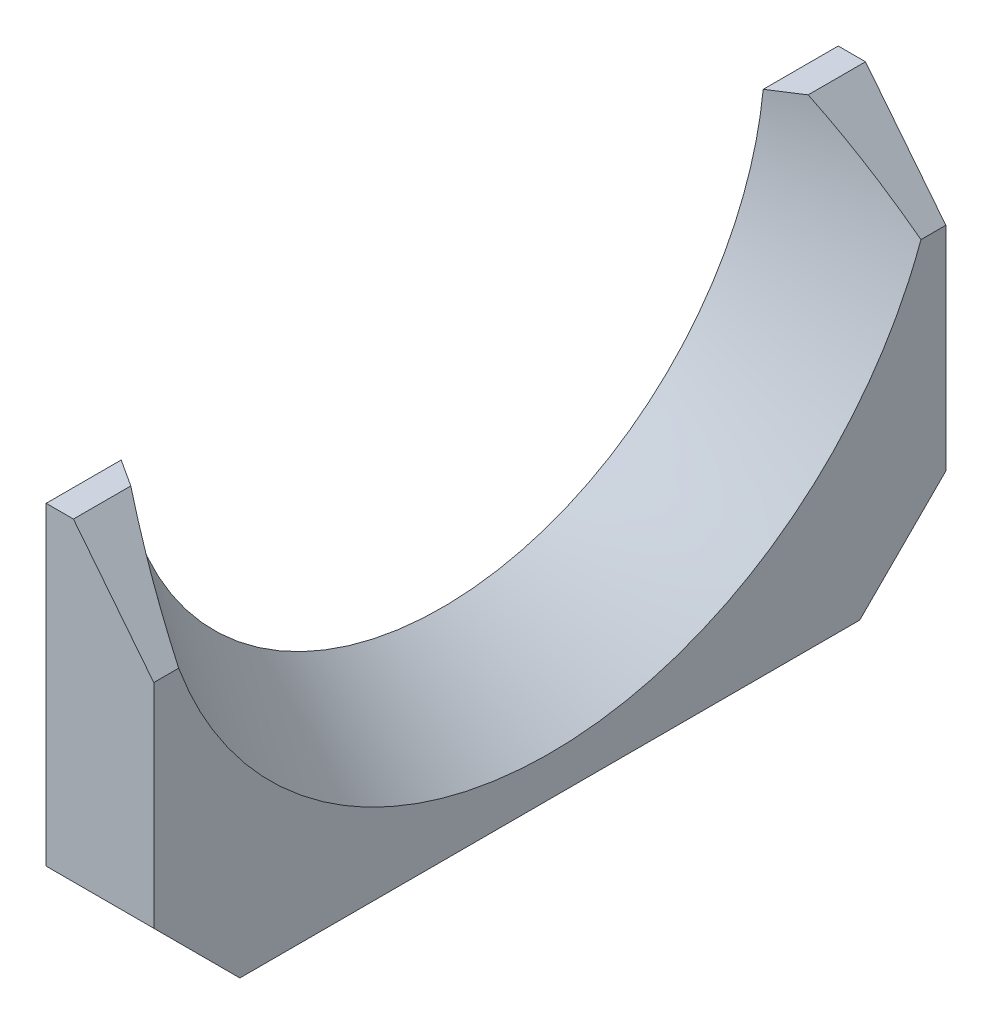
ISO-10303-21;
HEADER;
FILE_DESCRIPTION(('STEP AP214'),'2;1');
FILE_NAME('part.step','',(''),(''),'','','');
FILE_SCHEMA(('AUTOMOTIVE_DESIGN { 1 0 10303 214 1 1 1 1 }'));
ENDSEC;
DATA;
#1=APPLICATION_CONTEXT('core data for automotive mechanical design processes');
#2=APPLICATION_PROTOCOL_DEFINITION('international standard','automotive_design',2000,#1);
#3=PRODUCT_CONTEXT('',#1,'mechanical');
#4=PRODUCT('Part','Part','',(#3));
#5=PRODUCT_RELATED_PRODUCT_CATEGORY('part','',(#4));
#6=PRODUCT_DEFINITION_FORMATION('','',#4);
#7=PRODUCT_DEFINITION_CONTEXT('part definition',#1,'design');
#8=PRODUCT_DEFINITION('design','',#6,#7);
#9=PRODUCT_DEFINITION_SHAPE('','',#8);
#10=(LENGTH_UNIT() NAMED_UNIT(*) SI_UNIT(.MILLI.,.METRE.));
#11=(NAMED_UNIT(*) PLANE_ANGLE_UNIT() SI_UNIT($,.RADIAN.));
#12=(NAMED_UNIT(*) SI_UNIT($,.STERADIAN.) SOLID_ANGLE_UNIT());
#13=UNCERTAINTY_MEASURE_WITH_UNIT(LENGTH_MEASURE(1.E-05),#10,'distance_accuracy_value','');
#14=(GEOMETRIC_REPRESENTATION_CONTEXT(3) GLOBAL_UNCERTAINTY_ASSIGNED_CONTEXT((#13)) GLOBAL_UNIT_ASSIGNED_CONTEXT((#10,
#11,#12)) REPRESENTATION_CONTEXT('',''));
#15=CARTESIAN_POINT('',(0.,0.,0.));
#16=DIRECTION('',(0.,0.,1.));
#17=DIRECTION('',(1.,0.,0.));
#18=AXIS2_PLACEMENT_3D('',#15,#16,#17);
#19=CARTESIAN_POINT('',(40.,0.,46.));
#20=DIRECTION('',(-0.78388842022198,-0.620901718987707,0.));
#21=DIRECTION('',(0.620901718987707,-0.78388842022198,0.));
#22=AXIS2_PLACEMENT_3D('',#19,#20,#21);
#23=PLANE('',#22);
#24=CARTESIAN_POINT('',(25.0000000000023,18.9374999999923,45.0427405419363));
#25=CARTESIAN_POINT('',(24.4349773025542,19.6508411555235,45.0278701497398));
#26=CARTESIAN_POINT('',(23.8700509844943,20.3640606320755,45.0034108879433));
#27=CARTESIAN_POINT('',(22.7406011602301,21.78999103521,44.9352467037258));
#28=CARTESIAN_POINT('',(22.1760776897849,22.5027019166467,44.8915402449874));
#29=CARTESIAN_POINT('',(21.0477158224869,23.9272587741102,44.7848143878503));
#30=CARTESIAN_POINT('',(20.4838774481809,24.6391047216716,44.7217943702412));
#31=CARTESIAN_POINT('',(19.3568261069195,26.0620070400142,44.5762752048811));
#32=CARTESIAN_POINT('',(18.7936137290669,26.773062667053,44.4937642308345));
#33=CARTESIAN_POINT('',(17.6684393668148,28.1935952993963,44.3091200034553));
#34=CARTESIAN_POINT('',(17.1064773483213,28.9030723477443,44.2069872919556));
#35=CARTESIAN_POINT('',(15.9841193327255,30.3200493424341,43.9828904226733));
#36=CARTESIAN_POINT('',(15.423723282058,31.0275493564018,43.860926951877));
#37=CARTESIAN_POINT('',(13.6028358695461,33.326419714698,43.4312993554829));
#38=CARTESIAN_POINT('',(12.3459128192894,34.9132850656472,43.082599752207));
#39=CARTESIAN_POINT('',(10.4708018068084,37.2806127189044,42.480142461477));
#40=CARTESIAN_POINT('',(9.84757209589183,38.0674402289366,42.2661277226265));
#41=CARTESIAN_POINT('',(8.60495299673817,39.6362468416181,41.8109573894639));
#42=CARTESIAN_POINT('',(7.98556340546422,40.4182262006014,41.5698032432184));
#43=CARTESIAN_POINT('',(6.74351006973531,41.9863185369592,41.0564283648838));
#44=CARTESIAN_POINT('',(6.12090218631999,42.772360989771,40.7838569637255));
#45=CARTESIAN_POINT('',(4.88094976064341,44.3378009271877,40.2093177072164));
#46=CARTESIAN_POINT('',(4.2636050655579,45.1171986047332,39.9073507085924));
#47=CARTESIAN_POINT('',(3.03445801703282,46.6689967534961,39.2728910469721));
#48=CARTESIAN_POINT('',(2.42266027484338,47.4413914030103,38.940375161884));
#49=CARTESIAN_POINT('',(1.20593404427936,48.9775082690973,38.2439185855221));
#50=CARTESIAN_POINT('',(0.601006269719902,49.7412295844786,37.8799746619559));
#51=CARTESIAN_POINT('',(0.,50.5,37.4998029056484));
#52=B_SPLINE_CURVE_WITH_KNOTS('',3,(#24,#25,#26,#27,#28,#29,#30,#31,#32,#33,#34,#35,#36,#37,#38,
#39,#40,#41,#42,#43,#44,#45,#46,#47,#48,#49,#50,#51),.UNSPECIFIED.,.F.,.F.,(4,2,2,2,2,2,2,2,2,2,
2,2,2,4),(0.,2.730326248528,5.46087047207167,8.19150224852078,10.923795133035,13.6560125791106,
16.3881353946041,22.5473317867536,25.6259834380426,28.7044709007469,31.8214415569826,
34.9383213971172,38.0575904896956,41.1771807739762),.UNSPECIFIED.);
#53=CARTESIAN_POINT('',(12.5,34.71875,43.1091282926153));
#54=VERTEX_POINT('',#53);
#55=CARTESIAN_POINT('',(3.16831683168317,46.5,39.3385500107051));
#56=VERTEX_POINT('',#55);
#57=EDGE_CURVE('E260',#54,#56,#52,.T.);
#58=ORIENTED_EDGE('',*,*,#57,.T.);
#59=DIRECTION('',(0.,0.,1.));
#60=VECTOR('',#59,1.);
#61=CARTESIAN_POINT('',(3.16831683168317,46.5,-46.000025));
#62=LINE('',#61,#60);
#63=CARTESIAN_POINT('',(3.16831683168317,46.5,46.));
#64=VERTEX_POINT('',#63);
#65=EDGE_CURVE('E170',#56,#64,#62,.T.);
#66=ORIENTED_EDGE('',*,*,#65,.T.);
#67=DIRECTION('',(-0.620901718987707,0.78388842022198,0.));
#68=VECTOR('',#67,1.);
#69=CARTESIAN_POINT('',(40.,0.,46.));
#70=LINE('',#69,#68);
#71=CARTESIAN_POINT('',(12.5,34.71875,46.));
#72=VERTEX_POINT('',#71);
#73=EDGE_CURVE('E251',#72,#64,#70,.T.);
#74=ORIENTED_EDGE('',*,*,#73,.F.);
#75=DIRECTION('',(0.,0.,1.));
#76=VECTOR('',#75,1.);
#77=CARTESIAN_POINT('',(12.5,34.71875,-46.3822530127051));
#78=LINE('',#77,#76);
#79=EDGE_CURVE('E348',#54,#72,#78,.T.);
#80=ORIENTED_EDGE('',*,*,#79,.F.);
#81=EDGE_LOOP('',(#58,#66,#74,#80));
#82=FACE_BOUND('',#81,.T.);
#83=ADVANCED_FACE('F144',(#82),#23,.F.);
#84=CARTESIAN_POINT('',(0.,0.,46.));
#85=DIRECTION('',(0.,1.,0.));
#86=DIRECTION('',(0.,0.,1.));
#87=AXIS2_PLACEMENT_3D('',#84,#85,#86);
#88=PLANE('',#87);
#89=DIRECTION('',(0.,0.,-1.));
#90=VECTOR('',#89,1.);
#91=CARTESIAN_POINT('',(0.,0.,46.));
#92=LINE('',#91,#90);
#93=CARTESIAN_POINT('',(0.,0.,36.));
#94=VERTEX_POINT('',#93);
#95=CARTESIAN_POINT('',(0.,0.,-36.));
#96=VERTEX_POINT('',#95);
#97=EDGE_CURVE('E257',#94,#96,#92,.T.);
#98=ORIENTED_EDGE('',*,*,#97,.T.);
#99=DIRECTION('',(1.,0.,0.));
#100=VECTOR('',#99,1.);
#101=CARTESIAN_POINT('',(0.,0.,-36.));
#102=LINE('',#101,#100);
#103=CARTESIAN_POINT('',(12.5,0.,-36.));
#104=VERTEX_POINT('',#103);
#105=EDGE_CURVE('E444',#96,#104,#102,.T.);
#106=ORIENTED_EDGE('',*,*,#105,.T.);
#107=DIRECTION('',(0.,0.,1.));
#108=VECTOR('',#107,1.);
#109=CARTESIAN_POINT('',(12.5,0.,-46.3822530127051));
#110=LINE('',#109,#108);
#111=CARTESIAN_POINT('',(12.5,0.,36.));
#112=VERTEX_POINT('',#111);
#113=EDGE_CURVE('E349',#104,#112,#110,.T.);
#114=ORIENTED_EDGE('',*,*,#113,.T.);
#115=DIRECTION('',(-1.,0.,0.));
#116=VECTOR('',#115,1.);
#117=CARTESIAN_POINT('',(0.,0.,36.));
#118=LINE('',#117,#116);
#119=EDGE_CURVE('E443',#112,#94,#118,.T.);
#120=ORIENTED_EDGE('',*,*,#119,.T.);
#121=EDGE_LOOP('',(#98,#106,#114,#120));
#122=FACE_BOUND('',#121,.T.);
#123=ADVANCED_FACE('F387',(#122),#88,.F.);
#124=CARTESIAN_POINT('',(0.,50.5,46.));
#125=DIRECTION('',(1.,0.,0.));
#126=DIRECTION('',(0.,1.,0.));
#127=AXIS2_PLACEMENT_3D('',#124,#125,#126);
#128=PLANE('',#127);
#129=DIRECTION('',(0.,-1.,0.));
#130=VECTOR('',#129,1.);
#131=CARTESIAN_POINT('',(0.,50.5,46.));
#132=LINE('',#131,#130);
#133=CARTESIAN_POINT('',(0.,46.5,46.0000025));
#134=VERTEX_POINT('',#133);
#135=CARTESIAN_POINT('',(0.,10.,46.));
#136=VERTEX_POINT('',#135);
#137=EDGE_CURVE('E249',#134,#136,#132,.T.);
#138=ORIENTED_EDGE('',*,*,#137,.F.);
#139=DIRECTION('',(0.,0.,1.));
#140=VECTOR('',#139,1.);
#141=CARTESIAN_POINT('',(0.,46.5,-46.000025));
#142=LINE('',#141,#140);
#143=CARTESIAN_POINT('',(0.,46.5,37.2864864278492));
#144=VERTEX_POINT('',#143);
#145=EDGE_CURVE('E370',#144,#134,#142,.T.);
#146=ORIENTED_EDGE('',*,*,#145,.F.);
#147=CARTESIAN_POINT('',(0.,50.5,0.));
#148=DIRECTION('',(-1.,0.,0.));
#149=DIRECTION('',(0.,0.,1.));
#150=AXIS2_PLACEMENT_3D('',#147,#148,#149);
#151=CIRCLE('',#150,37.5);
#152=CARTESIAN_POINT('',(0.,13.5646498104053,-6.48304761451048));
#153=VERTEX_POINT('',#152);
#154=EDGE_CURVE('E148',#153,#144,#151,.T.);
#155=ORIENTED_EDGE('',*,*,#154,.F.);
#156=CARTESIAN_POINT('',(0.,34.8537732376838,-34.0799880883515));
#157=VERTEX_POINT('',#156);
#158=EDGE_CURVE('E253',#157,#153,#151,.T.);
#159=ORIENTED_EDGE('',*,*,#158,.F.);
#160=CARTESIAN_POINT('',(0.,46.4999999817167,-37.2864852261371));
#161=VERTEX_POINT('',#160);
#162=EDGE_CURVE('E354',#161,#157,#151,.T.);
#163=ORIENTED_EDGE('',*,*,#162,.F.);
#164=CARTESIAN_POINT('',(0.,46.5,-46.));
#165=VERTEX_POINT('',#164);
#166=EDGE_CURVE('E162',#165,#161,#142,.T.);
#167=ORIENTED_EDGE('',*,*,#166,.F.);
#168=DIRECTION('',(0.,-1.,0.));
#169=VECTOR('',#168,1.);
#170=CARTESIAN_POINT('',(0.,50.5,-46.));
#171=LINE('',#170,#169);
#172=CARTESIAN_POINT('',(0.,10.,-46.));
#173=VERTEX_POINT('',#172);
#174=EDGE_CURVE('E242',#165,#173,#171,.T.);
#175=ORIENTED_EDGE('',*,*,#174,.T.);
#176=DIRECTION('',(0.,0.707106781186549,-0.707106781186547));
#177=VECTOR('',#176,1.);
#178=CARTESIAN_POINT('',(0.,0.,-36.));
#179=LINE('',#178,#177);
#180=EDGE_CURVE('E426',#173,#96,#179,.F.);
#181=ORIENTED_EDGE('',*,*,#180,.T.);
#182=ORIENTED_EDGE('',*,*,#97,.F.);
#183=DIRECTION('',(0.,0.707106781186547,0.707106781186549));
#184=VECTOR('',#183,1.);
#185=CARTESIAN_POINT('',(0.,10.,46.));
#186=LINE('',#185,#184);
#187=EDGE_CURVE('E423',#94,#136,#186,.T.);
#188=ORIENTED_EDGE('',*,*,#187,.T.);
#189=EDGE_LOOP('',(#138,#146,#155,#159,#163,#167,#175,#181,#182,#188));
#190=FACE_BOUND('',#189,.T.);
#191=ADVANCED_FACE('F369',(#190),#128,.F.);
#192=DIRECTION('',(-0.620901718987707,0.78388842022198,0.));
#193=VECTOR('',#192,1.);
#194=CARTESIAN_POINT('',(40.,0.,-46.));
#195=LINE('',#194,#193);
#196=CARTESIAN_POINT('',(12.5,34.71875,-46.));
#197=VERTEX_POINT('',#196);
#198=CARTESIAN_POINT('',(3.16831683168317,46.5,-46.));
#199=VERTEX_POINT('',#198);
#200=EDGE_CURVE('E240',#197,#199,#195,.T.);
#201=ORIENTED_EDGE('',*,*,#200,.T.);
#202=CARTESIAN_POINT('',(3.16831683168317,46.5,-39.3388255070706));
#203=VERTEX_POINT('',#202);
#204=EDGE_CURVE('E227',#199,#203,#62,.T.);
#205=ORIENTED_EDGE('',*,*,#204,.T.);
#206=CARTESIAN_POINT('',(0.,50.5,-37.4998029056484));
#207=CARTESIAN_POINT('',(0.263737508595276,50.1670313953985,-37.6666061501655));
#208=CARTESIAN_POINT('',(0.528230736981965,49.8331086945603,-37.8303036478446));
#209=CARTESIAN_POINT('',(1.0586469731263,49.1634581964281,-38.1515685081798));
#210=CARTESIAN_POINT('',(1.32456997228431,48.8277304099911,-38.3091359076597));
#211=CARTESIAN_POINT('',(1.8577161523801,48.1546333576201,-38.6181943056714));
#212=CARTESIAN_POINT('',(2.12493907429329,47.8172644187048,-38.7696864632904));
#213=CARTESIAN_POINT('',(2.66066278466555,47.1409132343598,-39.0666839717316));
#214=CARTESIAN_POINT('',(2.92916357454526,46.8019309871366,-39.2121893158964));
#215=CARTESIAN_POINT('',(3.73647364477731,45.7827020234687,-39.6397238206521));
#216=CARTESIAN_POINT('',(4.27712304870118,45.1001321510148,-39.9127902352587));
#217=CARTESIAN_POINT('',(5.3620166485156,43.7304539812491,-40.4356824464389));
#218=CARTESIAN_POINT('',(5.9062557664341,43.043352094877,-40.6855356724375));
#219=CARTESIAN_POINT('',(6.99847308551007,41.6644277295435,-41.1631909029374));
#220=CARTESIAN_POINT('',(7.54645144302327,40.9726050531831,-41.3909919792075));
#221=CARTESIAN_POINT('',(8.64568194108116,39.5848265493851,-41.8250056638921));
#222=CARTESIAN_POINT('',(9.19693399960895,38.8888708254937,-42.0312188107636));
#223=CARTESIAN_POINT('',(10.0608885054493,37.7981282618702,-42.3368447490152));
#224=CARTESIAN_POINT('',(10.3726020566472,37.4045899034829,-42.4435601392261));
#225=CARTESIAN_POINT('',(10.9968894784973,36.6164270333972,-42.6502529860703));
#226=CARTESIAN_POINT('',(11.3094633514293,36.2218025188205,-42.7502304248301));
#227=CARTESIAN_POINT('',(12.2483331721397,35.0364793701736,-43.04025527509));
#228=CARTESIAN_POINT('',(12.8758176349026,34.2442802359355,-43.2204094449972));
#229=CARTESIAN_POINT('',(14.1335683881146,32.6563699100053,-43.555046360602));
#230=CARTESIAN_POINT('',(14.7638353394862,31.8606578838987,-43.7095226282767));
#231=CARTESIAN_POINT('',(16.0265767124356,30.2664469005501,-43.9931334896698));
#232=CARTESIAN_POINT('',(16.6590511519943,29.4679479206072,-44.1222678764757));
#233=CARTESIAN_POINT('',(17.6123540796288,28.2644029744686,-44.2976218659677));
#234=CARTESIAN_POINT('',(17.9325257370468,27.8601862569784,-44.3532503429463));
#235=CARTESIAN_POINT('',(18.5732756869726,27.0512394451971,-44.4580614041972));
#236=CARTESIAN_POINT('',(18.893853979606,26.6465093507475,-44.5072439864787));
#237=CARTESIAN_POINT('',(19.8561157445582,25.4316538724953,-44.6452497126539));
#238=CARTESIAN_POINT('',(20.4983358858484,24.6208509441163,-44.7245326307218));
#239=CARTESIAN_POINT('',(21.7834710553439,22.9983677926284,-44.8580437517072));
#240=CARTESIAN_POINT('',(22.4263856219267,22.1866881523179,-44.912283580887));
#241=CARTESIAN_POINT('',(23.7128244472575,20.5625591353371,-44.9959012512118));
#242=CARTESIAN_POINT('',(24.3563486927339,19.750109775422,-45.0252796216365));
#243=CARTESIAN_POINT('',(24.999999999999,18.9374999999972,-45.0422976354065));
#244=B_SPLINE_CURVE_WITH_KNOTS('',3,(#206,#207,#208,#209,#210,#211,#212,#213,#214,#215,#216,
#217,#218,#219,#220,#221,#222,#223,#224,#225,#226,#227,#228,#229,#230,#231,#232,#233,#234,#235,
#236,#237,#238,#239,#240,#241,#242,#243),.UNSPECIFIED.,.F.,.F.,(4,2,2,2,2,2,2,2,2,2,2,2,2,2,2,2,
2,2,4),(0.,1.36901308196145,2.73801793892773,4.10676035047547,5.47550428404584,8.21282572696977,
10.9468703952838,13.6810300965142,16.4151215846932,17.9548308734505,19.4945442463637,
22.5737716552522,25.653774716696,28.7338029248297,30.2897116257185,31.8456208071376,
34.9573916143532,38.0677163247409,41.1779748172413),.UNSPECIFIED.);
#245=CARTESIAN_POINT('',(12.5,34.71875,-43.1090931090802));
#246=VERTEX_POINT('',#245);
#247=EDGE_CURVE('E434',#203,#246,#244,.T.);
#248=ORIENTED_EDGE('',*,*,#247,.T.);
#249=EDGE_CURVE('E248',#197,#246,#78,.T.);
#250=ORIENTED_EDGE('',*,*,#249,.F.);
#251=EDGE_LOOP('',(#201,#205,#248,#250));
#252=FACE_BOUND('',#251,.T.);
#253=ADVANCED_FACE('F246',(#252),#23,.F.);
#254=CARTESIAN_POINT('',(0.,0.,46.));
#255=DIRECTION('',(0.,0.,1.));
#256=DIRECTION('',(1.,0.,0.));
#257=AXIS2_PLACEMENT_3D('',#254,#255,#256);
#258=PLANE('',#257);
#259=DIRECTION('',(1.,0.,0.));
#260=VECTOR('',#259,1.);
#261=CARTESIAN_POINT('',(0.,46.5,46.));
#262=LINE('',#261,#260);
#263=EDGE_CURVE('E243',#134,#64,#262,.T.);
#264=ORIENTED_EDGE('',*,*,#263,.F.);
#265=ORIENTED_EDGE('',*,*,#137,.T.);
#266=DIRECTION('',(1.,0.,0.));
#267=VECTOR('',#266,1.);
#268=CARTESIAN_POINT('',(12.5,10.,46.));
#269=LINE('',#268,#267);
#270=CARTESIAN_POINT('',(12.5,10.,46.));
#271=VERTEX_POINT('',#270);
#272=EDGE_CURVE('E429',#136,#271,#269,.T.);
#273=ORIENTED_EDGE('',*,*,#272,.T.);
#274=DIRECTION('',(0.,-1.,0.));
#275=VECTOR('',#274,1.);
#276=CARTESIAN_POINT('',(12.5,34.71875,46.));
#277=LINE('',#276,#275);
#278=EDGE_CURVE('E344',#72,#271,#277,.T.);
#279=ORIENTED_EDGE('',*,*,#278,.F.);
#280=ORIENTED_EDGE('',*,*,#73,.T.);
#281=EDGE_LOOP('',(#264,#265,#273,#279,#280));
#282=FACE_BOUND('',#281,.T.);
#283=ADVANCED_FACE('F290',(#282),#258,.T.);
#284=CARTESIAN_POINT('',(0.,0.,-46.));
#285=DIRECTION('',(0.,0.,1.));
#286=DIRECTION('',(1.,0.,0.));
#287=AXIS2_PLACEMENT_3D('',#284,#285,#286);
#288=PLANE('',#287);
#289=ORIENTED_EDGE('',*,*,#174,.F.);
#290=DIRECTION('',(1.,0.,0.));
#291=VECTOR('',#290,1.);
#292=CARTESIAN_POINT('',(0.,46.5,-46.));
#293=LINE('',#292,#291);
#294=EDGE_CURVE('E230',#165,#199,#293,.T.);
#295=ORIENTED_EDGE('',*,*,#294,.T.);
#296=ORIENTED_EDGE('',*,*,#200,.F.);
#297=DIRECTION('',(0.,-1.,0.));
#298=VECTOR('',#297,1.);
#299=CARTESIAN_POINT('',(12.5,0.,-46.));
#300=LINE('',#299,#298);
#301=CARTESIAN_POINT('',(12.5,10.,-46.));
#302=VERTEX_POINT('',#301);
#303=EDGE_CURVE('E352',#197,#302,#300,.T.);
#304=ORIENTED_EDGE('',*,*,#303,.T.);
#305=DIRECTION('',(-1.,0.,0.));
#306=VECTOR('',#305,1.);
#307=CARTESIAN_POINT('',(0.,10.,-46.));
#308=LINE('',#307,#306);
#309=EDGE_CURVE('E427',#302,#173,#308,.T.);
#310=ORIENTED_EDGE('',*,*,#309,.T.);
#311=EDGE_LOOP('',(#289,#295,#296,#304,#310));
#312=FACE_BOUND('',#311,.T.);
#313=ADVANCED_FACE('F238',(#312),#288,.F.);
#314=CARTESIAN_POINT('',(0.,34.8537732362068,-34.0799880876734));
#315=CARTESIAN_POINT('',(25.,40.534108750698,-54.0895647200741));
#316=CARTESIAN_POINT('',(0.,37.9421993699353,-35.4978939713758));
#317=CARTESIAN_POINT('',(25.,45.4358600310017,-54.9927023295476));
#318=CARTESIAN_POINT('',(0.,44.5064213949293,-37.4892226032101));
#319=CARTESIAN_POINT('',(25.,55.4858355052147,-55.4587889510262));
#320=CARTESIAN_POINT('',(0.,54.7937828809281,-37.7214219554838));
#321=CARTESIAN_POINT('',(25.,70.1952905972767,-52.0824620009772));
#322=CARTESIAN_POINT('',(0.,64.7654111776047,-35.183081038902));
#323=CARTESIAN_POINT('',(25.,83.4576574860455,-44.8809456377429));
#324=CARTESIAN_POINT('',(0.,73.6892417639536,-30.0600504656448));
#325=CARTESIAN_POINT('',(25.,94.2991024074197,-34.3822249993756));
#326=CARTESIAN_POINT('',(0.,80.9096675151136,-22.7289082244684));
#327=CARTESIAN_POINT('',(25.,101.923210445719,-21.3579000784437));
#328=CARTESIAN_POINT('',(0.,85.8960277861877,-13.7281995444291));
#329=CARTESIAN_POINT('',(25.0000000000001,105.769561623217,-6.76482651453678));
#330=CARTESIAN_POINT('',(0.,88.2827348449682,-3.71883631301551));
#331=CARTESIAN_POINT('',(25.,105.556511880247,8.32564274874456));
#332=CARTESIAN_POINT('',(0.,88.0228625331253,3.13586039033441));
#333=CARTESIAN_POINT('',(25.,102.717354982671,17.977504324728));
#334=CARTESIAN_POINT('',(0.,86.9131169948144,9.45832515013522));
#335=CARTESIAN_POINT('',(25.,98.8616710814252,26.5664763854993));
#336=CARTESIAN_POINT('',(0.,85.1464894166126,15.2819951924976));
#337=CARTESIAN_POINT('',(25.,94.251793353818,34.2096305743297));
#338=CARTESIAN_POINT('',(0.,80.4822698230476,23.129239398761));
#339=CARTESIAN_POINT('',(25.,84.793260692498,43.6857718481672));
#340=CARTESIAN_POINT('',(0.,74.0759901804474,29.6326052342755));
#341=CARTESIAN_POINT('',(25.,73.3421864472318,50.6236383917355));
#342=CARTESIAN_POINT('',(0.,68.8914944382186,32.8196273021602));
#343=CARTESIAN_POINT('',(25.,64.8230034984609,53.2867757338754));
#344=CARTESIAN_POINT('',(0.,63.0578006300647,35.4978939713758));
#345=CARTESIAN_POINT('',(25.,55.5641399689984,54.9927023295476));
#346=CARTESIAN_POINT('',(0.,56.4935786050708,37.48922260321));
#347=CARTESIAN_POINT('',(24.9999999999999,45.5141644947855,55.4587889510261));
#348=CARTESIAN_POINT('',(0.,46.2062171190719,37.7214219554838));
#349=CARTESIAN_POINT('',(25.0000000000001,30.8047094027232,52.0824620009773));
#350=CARTESIAN_POINT('',(0.,36.2345888223952,35.1830810389019));
#351=CARTESIAN_POINT('',(24.9999999999999,17.5423425139546,44.8809456377428));
#352=CARTESIAN_POINT('',(0.,27.3107582360466,30.0600504656449));
#353=CARTESIAN_POINT('',(25.0000000000001,6.70089759258029,34.3822249993757));
#354=CARTESIAN_POINT('',(0.,20.0903324848862,22.7289082244683));
#355=CARTESIAN_POINT('',(24.9999999999999,-0.923210445719292,21.3579000784437));
#356=CARTESIAN_POINT('',(0.,15.1039722138128,13.7281995444291));
#357=CARTESIAN_POINT('',(25.0000000000001,-4.76956162321752,6.76482651453685));
#358=CARTESIAN_POINT('',(0.,12.7172651550315,3.71883631301548));
#359=CARTESIAN_POINT('',(24.9999999999999,-4.55651188024707,-8.32564274874454));
#360=CARTESIAN_POINT('',(0.,12.9771374668747,-3.13586039033442));
#361=CARTESIAN_POINT('',(25.,-1.71735498267053,-17.977504324728));
#362=CARTESIAN_POINT('',(0.,14.0868830051856,-9.45832515013522));
#363=CARTESIAN_POINT('',(25.,2.13832891857479,-26.5664763854994));
#364=CARTESIAN_POINT('',(0.,15.8535105833874,-15.2819951924976));
#365=CARTESIAN_POINT('',(25.,6.74820664618212,-34.2096305743297));
#366=CARTESIAN_POINT('',(0.,20.5177301769525,-23.1292393987611));
#367=CARTESIAN_POINT('',(25.,16.2067393075018,-43.6857718481672));
#368=CARTESIAN_POINT('',(0.,26.9240098195525,-29.6326052342755));
#369=CARTESIAN_POINT('',(25.,27.6578135527684,-50.6236383917355));
#370=CARTESIAN_POINT('',(0.,32.1085055617814,-32.8196273021602));
#371=CARTESIAN_POINT('',(25.,36.1769965015392,-53.2867757338754));
#372=CARTESIAN_POINT('',(0.,34.8537732362068,-34.0799880876734));
#373=CARTESIAN_POINT('',(25.,40.534108750698,-54.0895647200741));
#374=B_SPLINE_SURFACE_WITH_KNOTS('',3,1,((#314,#315),(#316,#317),(#318,#319),(#320,#321),(#322,
#323),(#324,#325),(#326,#327),(#328,#329),(#330,#331),(#332,#333),(#334,#335),(#336,#337),(#338,
#339),(#340,#341),(#342,#343),(#344,#345),(#346,#347),(#348,#349),(#350,#351),(#352,#353),(#354,
#355),(#356,#357),(#358,#359),(#360,#361),(#362,#363),(#364,#365),(#366,#367),(#368,#369),(#370,
#371),(#372,#373)),.UNSPECIFIED.,.T.,.F.,.F.,(4,1,1,1,1,1,1,1,2,1,1,1,2,1,1,1,1,1,1,1,2,1,1,1,
4),(2,2),(0.,0.0432692307692308,0.0865384615384616,0.129807692307692,0.173076923076923,
0.216346153846154,0.259615384615385,0.302884615384615,0.346153846153846,0.384615384615385,
0.423076923076923,0.461538461538462,0.5,0.543269230769231,0.586538461538462,0.629807692307692,
0.673076923076923,0.716346153846154,0.759615384615385,0.802884615384616,0.846153846153846,
0.884615384615385,0.923076923076923,0.961538461538462,1.),(0.,1.),.UNSPECIFIED.);
#375=CARTESIAN_POINT('',(0.,46.499999999504,37.2863227244063));
#376=CARTESIAN_POINT('',(0.176946729238435,46.4999999998219,37.3988967846392));
#377=CARTESIAN_POINT('',(0.353730649428415,46.4999999999523,37.5117266475867));
#378=CARTESIAN_POINT('',(0.706978767695252,46.5000000000477,37.7378802287647));
#379=CARTESIAN_POINT('',(0.883442970307062,46.5000000000128,37.8512039399115));
#380=CARTESIAN_POINT('',(1.23606143296984,46.4999999999872,38.0783299300113));
#381=CARTESIAN_POINT('',(1.41221569507958,46.4999999999966,38.1921322057684));
#382=CARTESIAN_POINT('',(1.76422349326881,46.5000000000034,38.4202006646446));
#383=CARTESIAN_POINT('',(1.94007702952039,46.500000000001,38.5344668474981));
#384=CARTESIAN_POINT('',(2.29149270039638,46.499999999999,38.7634491680102));
#385=CARTESIAN_POINT('',(2.4670548329018,46.4999999999995,38.8781653089206));
#386=CARTESIAN_POINT('',(2.81789647882176,46.5000000000005,39.1080341527026));
#387=CARTESIAN_POINT('',(2.99317598836558,46.500000000001,39.2231868614821));
#388=CARTESIAN_POINT('',(3.16831683168317,46.5,39.3385500107051));
#389=B_SPLINE_CURVE_WITH_KNOTS('',3,(#375,#376,#377,#378,#379,#380,#381,#382,#383,#384,#385,
#386,#387,#388),.UNSPECIFIED.,.F.,.F.,(4,2,2,2,2,2,4),(0.,0.62916388720948,1.25831877922103,
1.88746947619089,2.51661981301992,3.14577470498072,3.77493814167807),.UNSPECIFIED.);
#390=EDGE_CURVE('E14',#144,#56,#389,.T.);
#391=CARTESIAN_POINT('',(12.5,34.71875,43.1091282926153));
#392=CARTESIAN_POINT('',(12.5,33.8463794662255,42.7896490217876));
#393=CARTESIAN_POINT('',(12.5,32.9836852288132,42.4437465480081));
#394=CARTESIAN_POINT('',(12.5,31.2807988006624,41.7004079366727));
#395=CARTESIAN_POINT('',(12.5,30.4406064744092,41.3029721095537));
#396=CARTESIAN_POINT('',(12.5,28.7858659068264,40.4578772720811));
#397=CARTESIAN_POINT('',(12.5,27.9713175672593,40.0102184541524));
#398=CARTESIAN_POINT('',(12.5,26.3722294451355,39.0667060535789));
#399=CARTESIAN_POINT('',(12.5,25.5876476915318,38.5709236011523));
#400=CARTESIAN_POINT('',(12.5,24.0499824267625,37.5327839818729));
#401=CARTESIAN_POINT('',(12.5,23.2968976158658,36.990428739686));
#402=CARTESIAN_POINT('',(12.5,21.8249136397961,35.8612866430162));
#403=CARTESIAN_POINT('',(12.5,21.1060116929777,35.2745034139882));
#404=CARTESIAN_POINT('',(12.5,19.7550531150557,34.1020121207245));
#405=CARTESIAN_POINT('',(12.5,19.1204621763175,33.5192265803735));
#406=CARTESIAN_POINT('',(12.5,18.19403838926,32.619000440864));
#407=CARTESIAN_POINT('',(12.5,17.8894671000185,32.3145760000573));
#408=CARTESIAN_POINT('',(12.5,17.2890612951009,31.6972300132996));
#409=CARTESIAN_POINT('',(12.5,16.9932267925368,31.3843084545974));
#410=CARTESIAN_POINT('',(12.5,16.1191656089087,30.433213056982));
#411=CARTESIAN_POINT('',(12.5,15.5543195331519,29.7826485121757));
#412=CARTESIAN_POINT('',(12.5,14.4622614841091,28.4510939506516));
#413=CARTESIAN_POINT('',(12.5,13.9350370188487,27.7701141563537));
#414=CARTESIAN_POINT('',(12.5,12.9195654389773,26.3796622864614));
#415=CARTESIAN_POINT('',(12.5,12.4313189290102,25.6701897691312));
#416=CARTESIAN_POINT('',(12.5,11.495407799131,24.2249576416553));
#417=CARTESIAN_POINT('',(12.5,11.0477425057734,23.4891984680193));
#418=CARTESIAN_POINT('',(12.5,10.3015253936201,22.1809564476458));
#419=CARTESIAN_POINT('',(12.5,9.99371091291937,21.6137396430488));
#420=CARTESIAN_POINT('',(12.5,9.40237852713675,20.4667864274978));
#421=CARTESIAN_POINT('',(12.5,9.11886217797601,19.8870492177763));
#422=CARTESIAN_POINT('',(12.5,8.3053436072265,18.1306637066507));
#423=CARTESIAN_POINT('',(12.5,7.81221503090123,16.9365663019572));
#424=CARTESIAN_POINT('',(12.5,7.14911963258702,15.1179430446931));
#425=CARTESIAN_POINT('',(12.5,6.94081955500184,14.5070288922546));
#426=CARTESIAN_POINT('',(12.5,6.55008508267962,13.2769191848157));
#427=CARTESIAN_POINT('',(12.5,6.36765071762962,12.6577236203113));
#428=CARTESIAN_POINT('',(12.5,6.02908336869998,11.4122014746953));
#429=CARTESIAN_POINT('',(12.5,5.87295019268726,10.7858749457119));
#430=CARTESIAN_POINT('',(12.5,5.58738588098783,9.52716482412734));
#431=CARTESIAN_POINT('',(12.5,5.45795470776366,8.89478124004248));
#432=CARTESIAN_POINT('',(12.5,5.22599684433854,7.62561864638101));
#433=CARTESIAN_POINT('',(12.5,5.12344830184203,6.98884364138036));
#434=CARTESIAN_POINT('',(12.5,4.94521635949211,5.71160469324331));
#435=CARTESIAN_POINT('',(12.5,4.8695330545389,5.07114073708399));
#436=CARTESIAN_POINT('',(12.5,4.68294588178157,3.14576867754041));
#437=CARTESIAN_POINT('',(12.5,4.61245340156577,1.85659900299184));
#438=CARTESIAN_POINT('',(12.5,4.58821569828158,-0.0776116829273122));
#439=CARTESIAN_POINT('',(12.5,4.59372399504493,-0.722480766962219));
#440=CARTESIAN_POINT('',(12.5,4.63202928325578,-2.01146563113061));
#441=CARTESIAN_POINT('',(12.5,4.66482620419221,-2.65558141320624));
#442=CARTESIAN_POINT('',(12.5,4.75764897923125,-3.94184314430899));
#443=CARTESIAN_POINT('',(12.5,4.81767488794818,-4.58398908938252));
#444=CARTESIAN_POINT('',(12.5,4.96469645124989,-5.86514781232681));
#445=CARTESIAN_POINT('',(12.5,5.0516922306996,-6.50416057567767));
#446=CARTESIAN_POINT('',(12.5,5.35300579667806,-8.41592311714317));
#447=CARTESIAN_POINT('',(12.5,5.60759000777103,-9.68257246411134));
#448=CARTESIAN_POINT('',(12.5,6.22231647864563,-12.1898351862031));
#449=CARTESIAN_POINT('',(12.5,6.58245815917005,-13.4304487041608));
#450=CARTESIAN_POINT('',(12.5,7.4063795523441,-15.8766808242099));
#451=CARTESIAN_POINT('',(12.5,7.87015260656652,-17.0823016689975));
#452=CARTESIAN_POINT('',(12.5,8.8974075903408,-19.4504471526757));
#453=CARTESIAN_POINT('',(12.5,9.46088973772798,-20.6129716974068));
#454=CARTESIAN_POINT('',(12.5,10.3779630560019,-22.3181982104524));
#455=CARTESIAN_POINT('',(12.5,10.6957748528688,-22.8804038657595));
#456=CARTESIAN_POINT('',(12.5,11.3548921833384,-23.9908737446562));
#457=CARTESIAN_POINT('',(12.5,11.6961976408506,-24.5391380133909));
#458=CARTESIAN_POINT('',(12.5,12.7544580482596,-26.1614512317315));
#459=CARTESIAN_POINT('',(12.5,13.5058874008781,-27.2132630064555));
#460=CARTESIAN_POINT('',(12.5,15.0948973140686,-29.250476295257));
#461=CARTESIAN_POINT('',(12.5,15.9325197467903,-30.2358451432954));
#462=CARTESIAN_POINT('',(12.5,17.2487433919471,-31.6581552517921));
#463=CARTESIAN_POINT('',(12.5,17.6974940021306,-32.1230086234758));
#464=CARTESIAN_POINT('',(12.5,18.6142779306236,-33.0332936374691));
#465=CARTESIAN_POINT('',(12.5,19.0823111946986,-33.478725334397));
#466=CARTESIAN_POINT('',(12.5,20.51330409921,-34.7840446576918));
#467=CARTESIAN_POINT('',(12.5,21.5039868199767,-35.613853050395));
#468=CARTESIAN_POINT('',(12.5,23.5517289913503,-37.1874053521967));
#469=CARTESIAN_POINT('',(12.5,24.6087987293387,-37.9311358715889));
#470=CARTESIAN_POINT('',(12.5,26.2373062206797,-38.9771303302236));
#471=CARTESIAN_POINT('',(12.5,26.7868008671167,-39.3139347257455));
#472=CARTESIAN_POINT('',(12.5,27.8995393605238,-39.9639987362314));
#473=CARTESIAN_POINT('',(12.5,28.4627836554385,-40.2772575827542));
#474=CARTESIAN_POINT('',(12.5,30.170932384459,-41.1806347196113));
#475=CARTESIAN_POINT('',(12.5,31.3351796905167,-41.7349486921622));
#476=CARTESIAN_POINT('',(12.5,32.8829274267936,-42.3937315773042));
#477=CARTESIAN_POINT('',(12.5,33.2477241941328,-42.5434924505071));
#478=CARTESIAN_POINT('',(12.5,33.9806697636118,-42.8334370470543));
#479=CARTESIAN_POINT('',(12.5,34.3488147277039,-42.9736304724554));
#480=CARTESIAN_POINT('',(12.5,34.71875,-43.1090931090802));
#481=B_SPLINE_CURVE_WITH_KNOTS('',3,(#391,#392,#393,#394,#395,#396,#397,#398,#399,#400,#401,
#402,#403,#404,#405,#406,#407,#408,#409,#410,#411,#412,#413,#414,#415,#416,#417,#418,#419,#420,
#421,#422,#423,#424,#425,#426,#427,#428,#429,#430,#431,#432,#433,#434,#435,#436,#437,#438,#439,
#440,#441,#442,#443,#444,#445,#446,#447,#448,#449,#450,#451,#452,#453,#454,#455,#456,#457,#458,
#459,#460,#461,#462,#463,#464,#465,#466,#467,#468,#469,#470,#471,#472,#473,#474,#475,#476,#477,
#478,#479,#480),.UNSPECIFIED.,.F.,.F.,(4,2,2,2,2,2,2,2,2,2,2,2,2,2,2,2,2,2,2,2,2,2,2,2,2,2,2,2,
2,2,2,2,2,2,2,2,2,2,2,2,2,2,2,2,4),(0.,2.78666718973878,5.573317593373,8.35995732056875,
11.1425391580281,13.9250060578763,16.7072461444176,19.2905689761849,20.58229351415,
21.874019990617,24.4572151195904,27.0395484878124,29.6219219065949,32.2042524630387,
34.1397382673956,36.0753479173514,39.9456197863123,41.8815422879897,43.8174670115793,
45.7533775924122,47.6892854517394,49.6236147401837,51.5579508614893,55.4257675818409,
57.3600127473992,59.2942529150775,61.2284969623586,63.1627499649232,67.0337286585498,
70.9046861101902,74.7753949201295,78.6461121865439,80.5830665490359,82.5200146384676,
86.3930877982355,90.2680514397829,92.2058927665255,94.1437286432533,98.015747214932,
101.888367285076,103.821350606326,105.754396985769,109.617194852908,110.800142852578,
111.981872865835),.UNSPECIFIED.);
#482=EDGE_CURVE('E317',#54,#246,#481,.T.);
#483=CARTESIAN_POINT('',(3.16831683168324,46.5,-39.3388255070706));
#484=CARTESIAN_POINT('',(2.99317562499389,46.5,-39.2234411086918));
#485=CARTESIAN_POINT('',(2.81789624840153,46.5,-39.1082663557024));
#486=CARTESIAN_POINT('',(2.46705545354147,46.5,-38.8783524484036));
#487=CARTESIAN_POINT('',(2.29149403913902,46.5,-38.7636132881958));
#488=CARTESIAN_POINT('',(1.94007998395552,46.5,-38.5345845697194));
#489=CARTESIAN_POINT('',(1.7642273453003,46.5,-38.4202950081893));
#490=CARTESIAN_POINT('',(1.4122210402814,46.5,-38.1921801484545));
#491=CARTESIAN_POINT('',(1.23606737373606,46.5,-38.0783548505301));
#492=CARTESIAN_POINT('',(0.883449289800024,46.5,-37.8511839804673));
#493=CARTESIAN_POINT('',(0.706984870346249,46.5,-37.737838411531));
#494=CARTESIAN_POINT('',(0.353734905855644,46.5,-37.5116432142652));
#495=CARTESIAN_POINT('',(0.176949356248526,46.5,-37.3987935930734));
#496=CARTESIAN_POINT('',(0.,46.5,-37.2862012978143));
#497=B_SPLINE_CURVE_WITH_KNOTS('',3,(#483,#484,#485,#486,#487,#488,#489,#490,#491,#492,#493,
#494,#495,#496),.UNSPECIFIED.,.F.,.F.,(4,2,2,2,2,2,4),(0.,0.629199419248926,1.25839028780486,
1.88757658357872,2.51676325917783,3.14595412779661,3.77515402226325),.UNSPECIFIED.);
#498=EDGE_CURVE('E154',#203,#161,#497,.T.);
#499=CARTESIAN_POINT('',(0.,87.8199822572108,-3.67338934241363));
#500=CARTESIAN_POINT('',(25.,104.882230946348,8.22352993219353));
#501=CARTESIAN_POINT('',(0.,88.1527986890468,-0.29148796134055));
#502=CARTESIAN_POINT('',(25.,104.136933431459,13.1515735367363));
#503=CARTESIAN_POINT('',(0.,88.0228625331253,3.13586039033441));
#504=CARTESIAN_POINT('',(25.,102.717354982671,17.977504324728));
#505=CARTESIAN_POINT('',(0.,86.9131169948144,9.45832515013522));
#506=CARTESIAN_POINT('',(25.,98.8616710814252,26.5664763854993));
#507=CARTESIAN_POINT('',(0.,85.1464894166126,15.2819951924976));
#508=CARTESIAN_POINT('',(25.,94.251793353818,34.2096305743297));
#509=CARTESIAN_POINT('',(0.,80.4822698230476,23.129239398761));
#510=CARTESIAN_POINT('',(25.,84.793260692498,43.6857718481672));
#511=CARTESIAN_POINT('',(0.,74.0759901804474,29.6326052342755));
#512=CARTESIAN_POINT('',(25.,73.3421864472318,50.6236383917355));
#513=CARTESIAN_POINT('',(0.,68.8914944382186,32.8196273021602));
#514=CARTESIAN_POINT('',(25.,64.8230034984609,53.2867757338754));
#515=CARTESIAN_POINT('',(0.,63.0578006300647,35.4978939713758));
#516=CARTESIAN_POINT('',(25.,55.5641399689984,54.9927023295476));
#517=CARTESIAN_POINT('',(0.,56.4935786050708,37.48922260321));
#518=CARTESIAN_POINT('',(24.9999999999999,45.5141644947855,55.4587889510261));
#519=CARTESIAN_POINT('',(0.,46.2062171190719,37.7214219554838));
#520=CARTESIAN_POINT('',(25.0000000000001,30.8047094027232,52.0824620009773));
#521=CARTESIAN_POINT('',(0.,36.2345888223952,35.1830810389019));
#522=CARTESIAN_POINT('',(24.9999999999999,17.5423425139546,44.8809456377428));
#523=CARTESIAN_POINT('',(0.,27.3107582360466,30.0600504656449));
#524=CARTESIAN_POINT('',(25.0000000000001,6.70089759258029,34.3822249993757));
#525=CARTESIAN_POINT('',(0.,20.0903324848862,22.7289082244683));
#526=CARTESIAN_POINT('',(24.9999999999999,-0.923210445719292,21.3579000784437));
#527=CARTESIAN_POINT('',(0.,15.1039722138128,13.7281995444291));
#528=CARTESIAN_POINT('',(25.0000000000001,-4.76956162321752,6.76482651453685));
#529=CARTESIAN_POINT('',(0.,12.7172651550315,3.71883631301548));
#530=CARTESIAN_POINT('',(24.9999999999999,-4.55651188024707,-8.32564274874454));
#531=CARTESIAN_POINT('',(0.,12.9771374668747,-3.13586039033442));
#532=CARTESIAN_POINT('',(25.,-1.71735498267053,-17.977504324728));
#533=CARTESIAN_POINT('',(0.,14.0868830051856,-9.45832515013522));
#534=CARTESIAN_POINT('',(25.,2.13832891857479,-26.5664763854994));
#535=CARTESIAN_POINT('',(0.,15.8535105833874,-15.2819951924976));
#536=CARTESIAN_POINT('',(25.,6.74820664618212,-34.2096305743297));
#537=CARTESIAN_POINT('',(0.,20.5177301769525,-23.1292393987611));
#538=CARTESIAN_POINT('',(25.,16.2067393075018,-43.6857718481672));
#539=CARTESIAN_POINT('',(0.,26.9240098195525,-29.6326052342755));
#540=CARTESIAN_POINT('',(25.,27.6578135527684,-50.6236383917355));
#541=CARTESIAN_POINT('',(0.,32.1085055617814,-32.8196273021602));
#542=CARTESIAN_POINT('',(25.,36.1769965015392,-53.2867757338754));
#543=CARTESIAN_POINT('',(0.,37.9421993699353,-35.4978939713758));
#544=CARTESIAN_POINT('',(25.,45.4358600310017,-54.9927023295476));
#545=CARTESIAN_POINT('',(0.,44.5064213949293,-37.4892226032101));
#546=CARTESIAN_POINT('',(25.,55.4858355052147,-55.4587889510262));
#547=CARTESIAN_POINT('',(0.,54.7937828809281,-37.7214219554838));
#548=CARTESIAN_POINT('',(25.,70.1952905972767,-52.0824620009772));
#549=CARTESIAN_POINT('',(0.,64.7654111776047,-35.183081038902));
#550=CARTESIAN_POINT('',(25.,83.4576574860455,-44.8809456377429));
#551=CARTESIAN_POINT('',(0.,73.6892417639536,-30.0600504656448));
#552=CARTESIAN_POINT('',(25.,94.2991024074197,-34.3822249993756));
#553=CARTESIAN_POINT('',(0.,80.9096675151136,-22.7289082244684));
#554=CARTESIAN_POINT('',(25.,101.923210445719,-21.3579000784437));
#555=CARTESIAN_POINT('',(0.,85.8960277861877,-13.7281995444291));
#556=CARTESIAN_POINT('',(25.0000000000001,105.769561623217,-6.76482651453678));
#557=CARTESIAN_POINT('',(0.,87.4871658253747,-7.05529072348671));
#558=CARTESIAN_POINT('',(25.,105.627528461237,3.29548632765078));
#559=CARTESIAN_POINT('',(0.,87.8199822572108,-3.67338934241363));
#560=CARTESIAN_POINT('',(25.,104.882230946348,8.22352993219353));
#561=B_SPLINE_SURFACE_WITH_KNOTS('',3,1,((#499,#500),(#501,#502),(#503,#504),(#505,#506),(#507,
#508),(#509,#510),(#511,#512),(#513,#514),(#515,#516),(#517,#518),(#519,#520),(#521,#522),(#523,
#524),(#525,#526),(#527,#528),(#529,#530),(#531,#532),(#533,#534),(#535,#536),(#537,#538),(#539,
#540),(#541,#542),(#543,#544),(#545,#546),(#547,#548),(#549,#550),(#551,#552),(#553,#554),(#555,
#556),(#557,#558),(#559,#560)),.UNSPECIFIED.,.T.,.F.,.F.,(4,2,1,1,1,2,1,1,1,1,1,1,1,2,1,1,1,2,1,
1,1,1,1,1,4),(2,2),(0.302884615384615,0.346153846153846,0.384615384615385,0.423076923076923,
0.461538461538462,0.5,0.543269230769231,0.586538461538462,0.629807692307692,0.673076923076923,
0.716346153846154,0.759615384615385,0.802884615384616,0.846153846153846,0.884615384615385,
0.923076923076923,0.961538461538462,1.,1.04326923076923,1.08653846153846,1.12980769230769,
1.17307692307692,1.21634615384615,1.25961538461538,1.30288461538462),(0.,1.),.UNSPECIFIED.);
#562=ORIENTED_EDGE('',*,*,#154,.T.);
#563=ORIENTED_EDGE('',*,*,#390,.T.);
#564=ORIENTED_EDGE('',*,*,#57,.F.);
#565=ORIENTED_EDGE('',*,*,#482,.T.);
#566=ORIENTED_EDGE('',*,*,#247,.F.);
#567=ORIENTED_EDGE('',*,*,#498,.T.);
#568=ORIENTED_EDGE('',*,*,#162,.T.);
#569=ORIENTED_EDGE('',*,*,#158,.T.);
#570=EDGE_LOOP('',(#562,#563,#564,#565,#566,#567,#568,#569));
#571=FACE_BOUND('',#570,.T.);
#572=ADVANCED_FACE('F279',(#571),#561,.F.);
#573=CARTESIAN_POINT('',(12.5,34.71875,-46.3822530127051));
#574=DIRECTION('',(-1.,0.,0.));
#575=DIRECTION('',(0.,-1.,0.));
#576=AXIS2_PLACEMENT_3D('',#573,#574,#575);
#577=PLANE('',#576);
#578=ORIENTED_EDGE('',*,*,#113,.F.);
#579=DIRECTION('',(0.,-0.707106781186549,0.707106781186547));
#580=VECTOR('',#579,1.);
#581=CARTESIAN_POINT('',(12.5,0.,-36.));
#582=LINE('',#581,#580);
#583=EDGE_CURVE('E449',#104,#302,#582,.F.);
#584=ORIENTED_EDGE('',*,*,#583,.T.);
#585=ORIENTED_EDGE('',*,*,#303,.F.);
#586=ORIENTED_EDGE('',*,*,#249,.T.);
#587=ORIENTED_EDGE('',*,*,#482,.F.);
#588=ORIENTED_EDGE('',*,*,#79,.T.);
#589=ORIENTED_EDGE('',*,*,#278,.T.);
#590=DIRECTION('',(0.,-0.707106781186547,-0.707106781186549));
#591=VECTOR('',#590,1.);
#592=CARTESIAN_POINT('',(12.5,10.,46.));
#593=LINE('',#592,#591);
#594=EDGE_CURVE('E430',#271,#112,#593,.T.);
#595=ORIENTED_EDGE('',*,*,#594,.T.);
#596=EDGE_LOOP('',(#578,#584,#585,#586,#587,#588,#589,#595));
#597=FACE_BOUND('',#596,.T.);
#598=ADVANCED_FACE('F286',(#597),#577,.F.);
#599=CARTESIAN_POINT('',(0.,0.,-36.));
#600=DIRECTION('',(0.,0.707106781186547,0.707106781186549));
#601=DIRECTION('',(1.,0.,0.));
#602=AXIS2_PLACEMENT_3D('',#599,#600,#601);
#603=PLANE('',#602);
#604=ORIENTED_EDGE('',*,*,#180,.F.);
#605=ORIENTED_EDGE('',*,*,#309,.F.);
#606=ORIENTED_EDGE('',*,*,#583,.F.);
#607=ORIENTED_EDGE('',*,*,#105,.F.);
#608=EDGE_LOOP('',(#604,#605,#606,#607));
#609=FACE_BOUND('',#608,.T.);
#610=ADVANCED_FACE('F388',(#609),#603,.F.);
#611=CARTESIAN_POINT('',(0.,10.,46.));
#612=DIRECTION('',(0.,-0.707106781186549,0.707106781186547));
#613=DIRECTION('',(-1.,0.,0.));
#614=AXIS2_PLACEMENT_3D('',#611,#612,#613);
#615=PLANE('',#614);
#616=ORIENTED_EDGE('',*,*,#187,.F.);
#617=ORIENTED_EDGE('',*,*,#119,.F.);
#618=ORIENTED_EDGE('',*,*,#594,.F.);
#619=ORIENTED_EDGE('',*,*,#272,.F.);
#620=EDGE_LOOP('',(#616,#617,#618,#619));
#621=FACE_BOUND('',#620,.T.);
#622=ADVANCED_FACE('F146',(#621),#615,.T.);
#623=CARTESIAN_POINT('',(0.,46.5,-46.000025));
#624=DIRECTION('',(0.,-1.,0.));
#625=DIRECTION('',(0.,0.,-1.));
#626=AXIS2_PLACEMENT_3D('',#623,#624,#625);
#627=PLANE('',#626);
#628=ORIENTED_EDGE('',*,*,#166,.T.);
#629=ORIENTED_EDGE('',*,*,#498,.F.);
#630=ORIENTED_EDGE('',*,*,#204,.F.);
#631=ORIENTED_EDGE('',*,*,#294,.F.);
#632=EDGE_LOOP('',(#628,#629,#630,#631));
#633=FACE_BOUND('',#632,.T.);
#634=ADVANCED_FACE('F229',(#633),#627,.F.);
#635=ORIENTED_EDGE('',*,*,#263,.T.);
#636=ORIENTED_EDGE('',*,*,#65,.F.);
#637=ORIENTED_EDGE('',*,*,#390,.F.);
#638=ORIENTED_EDGE('',*,*,#145,.T.);
#639=EDGE_LOOP('',(#635,#636,#637,#638));
#640=FACE_BOUND('',#639,.T.);
#641=ADVANCED_FACE('F333',(#640),#627,.F.);
#642=CLOSED_SHELL('',(#83,#123,#191,#253,#283,#313,#572,#598,#610,#622,#634,#641));
#643=MANIFOLD_SOLID_BREP('B2',#642);
#644=ADVANCED_BREP_SHAPE_REPRESENTATION('',(#18,#643),#14);
#645=SHAPE_DEFINITION_REPRESENTATION(#9,#644);
ENDSEC;
END-ISO-10303-21;
